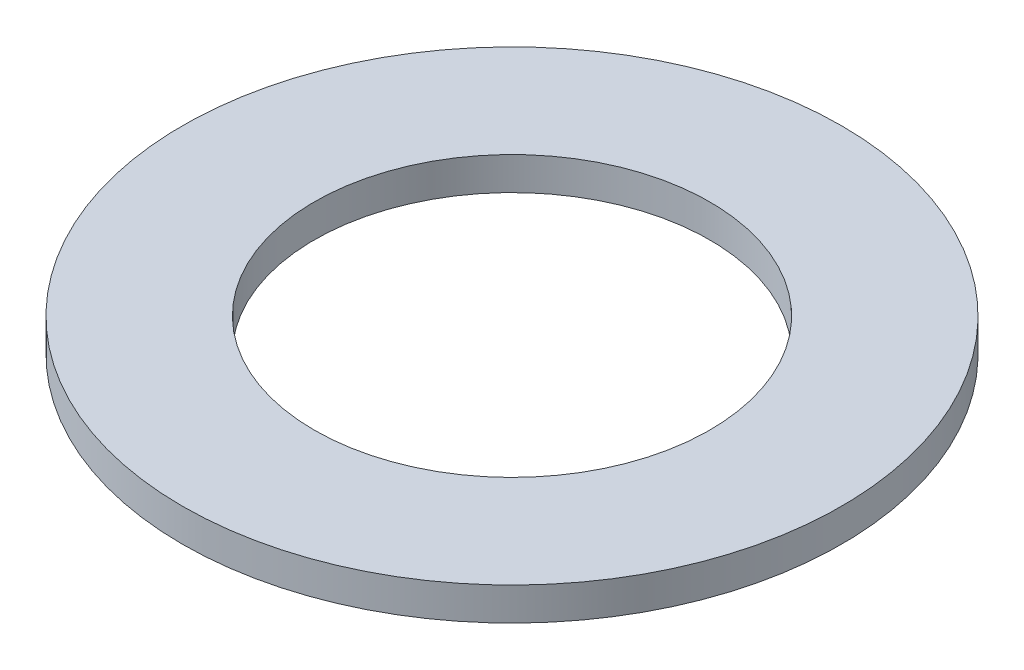
ISO-10303-21;
HEADER;
FILE_DESCRIPTION(('STEP AP214'),'2;1');
FILE_NAME('part.step','',(''),(''),'','','');
FILE_SCHEMA(('AUTOMOTIVE_DESIGN { 1 0 10303 214 1 1 1 1 }'));
ENDSEC;
DATA;
#1=APPLICATION_CONTEXT('core data for automotive mechanical design processes');
#2=APPLICATION_PROTOCOL_DEFINITION('international standard','automotive_design',2000,#1);
#3=PRODUCT_CONTEXT('',#1,'mechanical');
#4=PRODUCT('Part','Part','',(#3));
#5=PRODUCT_RELATED_PRODUCT_CATEGORY('part','',(#4));
#6=PRODUCT_DEFINITION_FORMATION('','',#4);
#7=PRODUCT_DEFINITION_CONTEXT('part definition',#1,'design');
#8=PRODUCT_DEFINITION('design','',#6,#7);
#9=PRODUCT_DEFINITION_SHAPE('','',#8);
#10=(LENGTH_UNIT() NAMED_UNIT(*) SI_UNIT(.MILLI.,.METRE.));
#11=(NAMED_UNIT(*) PLANE_ANGLE_UNIT() SI_UNIT($,.RADIAN.));
#12=(NAMED_UNIT(*) SI_UNIT($,.STERADIAN.) SOLID_ANGLE_UNIT());
#13=UNCERTAINTY_MEASURE_WITH_UNIT(LENGTH_MEASURE(1.E-05),#10,'distance_accuracy_value','');
#14=(GEOMETRIC_REPRESENTATION_CONTEXT(3) GLOBAL_UNCERTAINTY_ASSIGNED_CONTEXT((#13)) GLOBAL_UNIT_ASSIGNED_CONTEXT((#10,
#11,#12)) REPRESENTATION_CONTEXT('',''));
#15=CARTESIAN_POINT('',(0.,0.,0.));
#16=DIRECTION('',(0.,0.,1.));
#17=DIRECTION('',(1.,0.,0.));
#18=AXIS2_PLACEMENT_3D('',#15,#16,#17);
#19=CARTESIAN_POINT('',(0.,3.175,0.));
#20=DIRECTION('',(0.,1.,0.));
#21=DIRECTION('',(0.,0.,1.));
#22=AXIS2_PLACEMENT_3D('',#19,#20,#21);
#23=PLANE('',#22);
#24=CARTESIAN_POINT('',(0.,3.175,0.));
#25=DIRECTION('',(0.,1.,0.));
#26=DIRECTION('',(0.,0.,1.));
#27=AXIS2_PLACEMENT_3D('',#24,#25,#26);
#28=CIRCLE('',#27,31.75);
#29=CARTESIAN_POINT('',(0.,3.175,31.75));
#30=VERTEX_POINT('',#29);
#31=EDGE_CURVE('E10',#30,#30,#28,.T.);
#32=ORIENTED_EDGE('',*,*,#31,.T.);
#33=EDGE_LOOP('',(#32));
#34=FACE_BOUND('',#33,.T.);
#35=CARTESIAN_POINT('',(0.,3.175,0.));
#36=DIRECTION('',(0.,1.,0.));
#37=DIRECTION('',(0.,0.,1.));
#38=AXIS2_PLACEMENT_3D('',#35,#36,#37);
#39=CIRCLE('',#38,19.05);
#40=CARTESIAN_POINT('',(0.,3.175,19.05));
#41=VERTEX_POINT('',#40);
#42=EDGE_CURVE('E46',#41,#41,#39,.T.);
#43=ORIENTED_EDGE('',*,*,#42,.F.);
#44=EDGE_LOOP('',(#43));
#45=FACE_BOUND('',#44,.T.);
#46=ADVANCED_FACE('F35',(#34,#45),#23,.T.);
#47=CARTESIAN_POINT('',(0.,0.,0.));
#48=DIRECTION('',(0.,1.,0.));
#49=DIRECTION('',(0.,0.,1.));
#50=AXIS2_PLACEMENT_3D('',#47,#48,#49);
#51=PLANE('',#50);
#52=CARTESIAN_POINT('',(0.,0.,0.));
#53=DIRECTION('',(0.,1.,0.));
#54=DIRECTION('',(0.,0.,1.));
#55=AXIS2_PLACEMENT_3D('',#52,#53,#54);
#56=CIRCLE('',#55,31.75);
#57=CARTESIAN_POINT('',(0.,0.,31.75));
#58=VERTEX_POINT('',#57);
#59=EDGE_CURVE('E39',#58,#58,#56,.T.);
#60=ORIENTED_EDGE('',*,*,#59,.F.);
#61=EDGE_LOOP('',(#60));
#62=FACE_BOUND('',#61,.T.);
#63=CARTESIAN_POINT('',(0.,0.,0.));
#64=DIRECTION('',(0.,1.,0.));
#65=DIRECTION('',(0.,0.,1.));
#66=AXIS2_PLACEMENT_3D('',#63,#64,#65);
#67=CIRCLE('',#66,19.05);
#68=CARTESIAN_POINT('',(0.,0.,19.05));
#69=VERTEX_POINT('',#68);
#70=EDGE_CURVE('E48',#69,#69,#67,.T.);
#71=ORIENTED_EDGE('',*,*,#70,.T.);
#72=EDGE_LOOP('',(#71));
#73=FACE_BOUND('',#72,.T.);
#74=ADVANCED_FACE('F58',(#62,#73),#51,.F.);
#75=CARTESIAN_POINT('',(0.,3.175,0.));
#76=DIRECTION('',(0.,-1.,0.));
#77=DIRECTION('',(0.,0.,-1.));
#78=AXIS2_PLACEMENT_3D('',#75,#76,#77);
#79=CYLINDRICAL_SURFACE('',#78,31.75);
#80=ORIENTED_EDGE('',*,*,#31,.F.);
#81=EDGE_LOOP('',(#80));
#82=FACE_BOUND('',#81,.T.);
#83=ORIENTED_EDGE('',*,*,#59,.T.);
#84=EDGE_LOOP('',(#83));
#85=FACE_BOUND('',#84,.T.);
#86=ADVANCED_FACE('F37',(#82,#85),#79,.T.);
#87=CARTESIAN_POINT('',(0.,3.175,0.));
#88=DIRECTION('',(0.,-1.,0.));
#89=DIRECTION('',(0.,0.,-1.));
#90=AXIS2_PLACEMENT_3D('',#87,#88,#89);
#91=CYLINDRICAL_SURFACE('',#90,19.05);
#92=ORIENTED_EDGE('',*,*,#42,.T.);
#93=EDGE_LOOP('',(#92));
#94=FACE_BOUND('',#93,.T.);
#95=ORIENTED_EDGE('',*,*,#70,.F.);
#96=EDGE_LOOP('',(#95));
#97=FACE_BOUND('',#96,.T.);
#98=ADVANCED_FACE('F54',(#94,#97),#91,.F.);
#99=CLOSED_SHELL('',(#46,#74,#86,#98));
#100=MANIFOLD_SOLID_BREP('B2',#99);
#101=ADVANCED_BREP_SHAPE_REPRESENTATION('',(#18,#100),#14);
#102=SHAPE_DEFINITION_REPRESENTATION(#9,#101);
ENDSEC;
END-ISO-10303-21;
